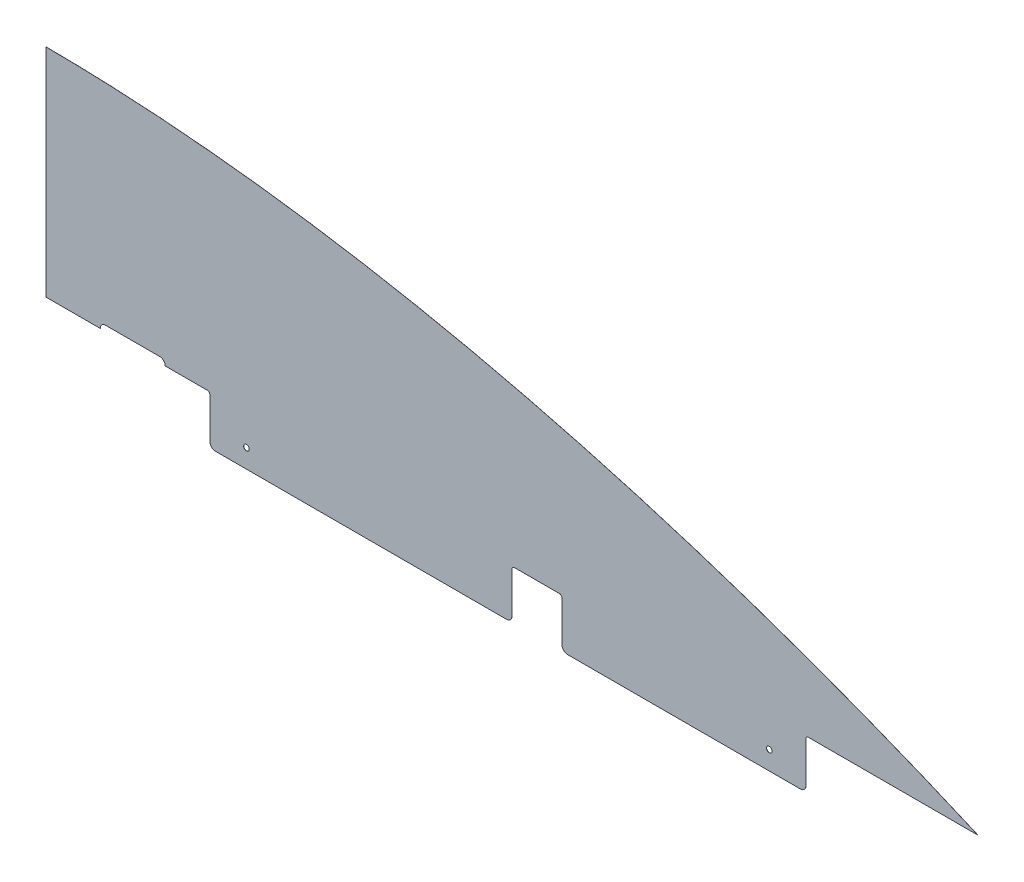
ISO-10303-21;
HEADER;
FILE_DESCRIPTION(('STEP AP214'),'2;1');
FILE_NAME('part.step','',(''),(''),'','','');
FILE_SCHEMA(('AUTOMOTIVE_DESIGN { 1 0 10303 214 1 1 1 1 }'));
ENDSEC;
DATA;
#1=APPLICATION_CONTEXT('core data for automotive mechanical design processes');
#2=APPLICATION_PROTOCOL_DEFINITION('international standard','automotive_design',2000,#1);
#3=PRODUCT_CONTEXT('',#1,'mechanical');
#4=PRODUCT('Part','Part','',(#3));
#5=PRODUCT_RELATED_PRODUCT_CATEGORY('part','',(#4));
#6=PRODUCT_DEFINITION_FORMATION('','',#4);
#7=PRODUCT_DEFINITION_CONTEXT('part definition',#1,'design');
#8=PRODUCT_DEFINITION('design','',#6,#7);
#9=PRODUCT_DEFINITION_SHAPE('','',#8);
#10=(LENGTH_UNIT() NAMED_UNIT(*) SI_UNIT(.MILLI.,.METRE.));
#11=(NAMED_UNIT(*) PLANE_ANGLE_UNIT() SI_UNIT($,.RADIAN.));
#12=(NAMED_UNIT(*) SI_UNIT($,.STERADIAN.) SOLID_ANGLE_UNIT());
#13=UNCERTAINTY_MEASURE_WITH_UNIT(LENGTH_MEASURE(1.E-05),#10,'distance_accuracy_value','');
#14=(GEOMETRIC_REPRESENTATION_CONTEXT(3) GLOBAL_UNCERTAINTY_ASSIGNED_CONTEXT((#13)) GLOBAL_UNIT_ASSIGNED_CONTEXT((#10,
#11,#12)) REPRESENTATION_CONTEXT('',''));
#15=CARTESIAN_POINT('',(0.,0.,0.));
#16=DIRECTION('',(0.,0.,1.));
#17=DIRECTION('',(1.,0.,0.));
#18=AXIS2_PLACEMENT_3D('',#15,#16,#17);
#19=CARTESIAN_POINT('',(566.574596477157,179.041017308607,0.));
#20=DIRECTION('',(0.,0.,1.));
#21=DIRECTION('',(1.,0.,0.));
#22=AXIS2_PLACEMENT_3D('',#19,#20,#21);
#23=PLANE('',#22);
#24=CARTESIAN_POINT('',(234.95,-35.3060000000001,0.));
#25=DIRECTION('',(0.,0.,-1.));
#26=DIRECTION('',(-1.,0.,0.));
#27=AXIS2_PLACEMENT_3D('',#24,#25,#26);
#28=CIRCLE('',#27,3.26389999999993);
#29=CARTESIAN_POINT('',(231.6861,-35.3060000000001,0.));
#30=VERTEX_POINT('',#29);
#31=EDGE_CURVE('E457',#30,#30,#28,.T.);
#32=ORIENTED_EDGE('',*,*,#31,.F.);
#33=EDGE_LOOP('',(#32));
#34=FACE_BOUND('',#33,.T.);
#35=DIRECTION('',(0.,-1.,0.));
#36=VECTOR('',#35,1.);
#37=CARTESIAN_POINT('',(546.1,-57.15,0.));
#38=LINE('',#37,#36);
#39=CARTESIAN_POINT('',(546.1,-3.17499999999999,0.));
#40=VERTEX_POINT('',#39);
#41=CARTESIAN_POINT('',(546.1,-50.8,0.));
#42=VERTEX_POINT('',#41);
#43=EDGE_CURVE('E423',#40,#42,#38,.T.);
#44=ORIENTED_EDGE('',*,*,#43,.T.);
#45=CARTESIAN_POINT('',(539.75,-50.8,0.));
#46=DIRECTION('',(0.,0.,1.));
#47=DIRECTION('',(1.,0.,0.));
#48=AXIS2_PLACEMENT_3D('',#45,#46,#47);
#49=CIRCLE('',#48,6.35);
#50=CARTESIAN_POINT('',(539.75,-57.15,0.));
#51=VERTEX_POINT('',#50);
#52=EDGE_CURVE('E405',#42,#51,#49,.F.);
#53=ORIENTED_EDGE('',*,*,#52,.T.);
#54=DIRECTION('',(-1.,0.,0.));
#55=VECTOR('',#54,1.);
#56=CARTESIAN_POINT('',(192.0875,-57.15,0.));
#57=LINE('',#56,#55);
#58=CARTESIAN_POINT('',(198.4375,-57.15,0.));
#59=VERTEX_POINT('',#58);
#60=EDGE_CURVE('E436',#51,#59,#57,.T.);
#61=ORIENTED_EDGE('',*,*,#60,.T.);
#62=CARTESIAN_POINT('',(198.4375,-50.8,0.));
#63=DIRECTION('',(0.,0.,1.));
#64=DIRECTION('',(1.,0.,0.));
#65=AXIS2_PLACEMENT_3D('',#62,#63,#64);
#66=CIRCLE('',#65,6.35);
#67=CARTESIAN_POINT('',(192.0875,-50.8,0.));
#68=VERTEX_POINT('',#67);
#69=EDGE_CURVE('E53',#59,#68,#66,.F.);
#70=ORIENTED_EDGE('',*,*,#69,.T.);
#71=DIRECTION('',(0.,1.,0.));
#72=VECTOR('',#71,1.);
#73=CARTESIAN_POINT('',(192.0875,0.,0.));
#74=LINE('',#73,#72);
#75=CARTESIAN_POINT('',(192.0875,-3.175,0.));
#76=VERTEX_POINT('',#75);
#77=EDGE_CURVE('E420',#68,#76,#74,.T.);
#78=ORIENTED_EDGE('',*,*,#77,.T.);
#79=CARTESIAN_POINT('',(188.9125,-3.175,0.));
#80=DIRECTION('',(0.,0.,1.));
#81=DIRECTION('',(1.,0.,0.));
#82=AXIS2_PLACEMENT_3D('',#79,#80,#81);
#83=CIRCLE('',#82,3.175);
#84=CARTESIAN_POINT('',(188.9125,0.,0.));
#85=VERTEX_POINT('',#84);
#86=EDGE_CURVE('E194',#76,#85,#83,.T.);
#87=ORIENTED_EDGE('',*,*,#86,.T.);
#88=DIRECTION('',(1.,0.,0.));
#89=VECTOR('',#88,1.);
#90=CARTESIAN_POINT('',(0.,0.,0.));
#91=LINE('',#90,#89);
#92=CARTESIAN_POINT('',(139.7,0.,0.));
#93=VERTEX_POINT('',#92);
#94=EDGE_CURVE('E186',#93,#85,#91,.T.);
#95=ORIENTED_EDGE('',*,*,#94,.F.);
#96=CARTESIAN_POINT('',(133.35,0.,0.));
#97=DIRECTION('',(0.,0.,-1.));
#98=DIRECTION('',(-1.,0.,0.));
#99=AXIS2_PLACEMENT_3D('',#96,#97,#98);
#100=CIRCLE('',#99,6.35000000000017);
#101=CARTESIAN_POINT('',(133.35,6.35000000000018,0.));
#102=VERTEX_POINT('',#101);
#103=EDGE_CURVE('E191',#102,#93,#100,.T.);
#104=ORIENTED_EDGE('',*,*,#103,.F.);
#105=DIRECTION('',(1.,0.,0.));
#106=VECTOR('',#105,1.);
#107=CARTESIAN_POINT('',(69.85,6.35000000000017,0.));
#108=LINE('',#107,#106);
#109=CARTESIAN_POINT('',(69.85,6.35000000000016,0.));
#110=VERTEX_POINT('',#109);
#111=EDGE_CURVE('E220',#110,#102,#108,.T.);
#112=ORIENTED_EDGE('',*,*,#111,.F.);
#113=CARTESIAN_POINT('',(69.85,0.,0.));
#114=DIRECTION('',(0.,0.,-1.));
#115=DIRECTION('',(1.,0.,0.));
#116=AXIS2_PLACEMENT_3D('',#113,#114,#115);
#117=CIRCLE('',#116,6.35000000000008);
#118=CARTESIAN_POINT('',(63.4999999999999,0.,0.));
#119=VERTEX_POINT('',#118);
#120=EDGE_CURVE('E222',#119,#110,#117,.T.);
#121=ORIENTED_EDGE('',*,*,#120,.F.);
#122=CARTESIAN_POINT('',(0.,0.,0.));
#123=VERTEX_POINT('',#122);
#124=EDGE_CURVE('E198',#123,#119,#91,.T.);
#125=ORIENTED_EDGE('',*,*,#124,.F.);
#126=DIRECTION('',(0.,-1.,0.));
#127=VECTOR('',#126,1.);
#128=CARTESIAN_POINT('',(0.,254.,0.));
#129=LINE('',#128,#127);
#130=CARTESIAN_POINT('',(0.,254.,0.));
#131=VERTEX_POINT('',#130);
#132=EDGE_CURVE('E337',#131,#123,#129,.T.);
#133=ORIENTED_EDGE('',*,*,#132,.F.);
#134=CARTESIAN_POINT('',(1092.2,-3.05594159067454E-13,0.));
#135=CARTESIAN_POINT('',(770.285770074945,140.499670678071,0.));
#136=CARTESIAN_POINT('',(376.513153864139,252.276375478215,0.));
#137=CARTESIAN_POINT('',(0.,254.,0.));
#138=B_SPLINE_CURVE_WITH_KNOTS('',3,(#134,#135,#136,#137),.UNSPECIFIED.,.F.,.F.,(4,4),(0.,1.),.UNSPECIFIED.);
#139=CARTESIAN_POINT('',(1092.2,0.,0.));
#140=VERTEX_POINT('',#139);
#141=EDGE_CURVE('E235',#140,#131,#138,.T.);
#142=ORIENTED_EDGE('',*,*,#141,.F.);
#143=CARTESIAN_POINT('',(893.7625,0.,0.));
#144=VERTEX_POINT('',#143);
#145=EDGE_CURVE('E199',#144,#140,#91,.T.);
#146=ORIENTED_EDGE('',*,*,#145,.F.);
#147=CARTESIAN_POINT('',(893.7625,-3.175,0.));
#148=DIRECTION('',(0.,0.,1.));
#149=DIRECTION('',(1.,0.,0.));
#150=AXIS2_PLACEMENT_3D('',#147,#148,#149);
#151=CIRCLE('',#150,3.175);
#152=CARTESIAN_POINT('',(890.5875,-3.175,0.));
#153=VERTEX_POINT('',#152);
#154=EDGE_CURVE('E381',#144,#153,#151,.T.);
#155=ORIENTED_EDGE('',*,*,#154,.T.);
#156=DIRECTION('',(0.,-1.,0.));
#157=VECTOR('',#156,1.);
#158=CARTESIAN_POINT('',(890.5875,0.,0.));
#159=LINE('',#158,#157);
#160=CARTESIAN_POINT('',(890.5875,-50.8,0.));
#161=VERTEX_POINT('',#160);
#162=EDGE_CURVE('E434',#153,#161,#159,.T.);
#163=ORIENTED_EDGE('',*,*,#162,.T.);
#164=CARTESIAN_POINT('',(884.2375,-50.8,0.));
#165=DIRECTION('',(0.,0.,1.));
#166=DIRECTION('',(1.,0.,0.));
#167=AXIS2_PLACEMENT_3D('',#164,#165,#166);
#168=CIRCLE('',#167,6.35);
#169=CARTESIAN_POINT('',(884.2375,-57.15,0.));
#170=VERTEX_POINT('',#169);
#171=EDGE_CURVE('E400',#161,#170,#168,.F.);
#172=ORIENTED_EDGE('',*,*,#171,.T.);
#173=CARTESIAN_POINT('',(611.1875,-57.15,0.));
#174=VERTEX_POINT('',#173);
#175=EDGE_CURVE('E216',#170,#174,#57,.T.);
#176=ORIENTED_EDGE('',*,*,#175,.T.);
#177=CARTESIAN_POINT('',(611.1875,-50.8,0.));
#178=DIRECTION('',(0.,0.,1.));
#179=DIRECTION('',(1.,0.,0.));
#180=AXIS2_PLACEMENT_3D('',#177,#178,#179);
#181=CIRCLE('',#180,6.35);
#182=CARTESIAN_POINT('',(604.8375,-50.8,0.));
#183=VERTEX_POINT('',#182);
#184=EDGE_CURVE('E403',#174,#183,#181,.F.);
#185=ORIENTED_EDGE('',*,*,#184,.T.);
#186=DIRECTION('',(0.,1.,0.));
#187=VECTOR('',#186,1.);
#188=CARTESIAN_POINT('',(604.8375,-57.15,0.));
#189=LINE('',#188,#187);
#190=CARTESIAN_POINT('',(604.8375,-3.175,0.));
#191=VERTEX_POINT('',#190);
#192=EDGE_CURVE('E445',#183,#191,#189,.T.);
#193=ORIENTED_EDGE('',*,*,#192,.T.);
#194=CARTESIAN_POINT('',(601.6625,-3.175,0.));
#195=DIRECTION('',(0.,0.,1.));
#196=DIRECTION('',(1.,0.,0.));
#197=AXIS2_PLACEMENT_3D('',#194,#195,#196);
#198=CIRCLE('',#197,3.175);
#199=CARTESIAN_POINT('',(601.6625,0.,0.));
#200=VERTEX_POINT('',#199);
#201=EDGE_CURVE('E377',#191,#200,#198,.T.);
#202=ORIENTED_EDGE('',*,*,#201,.T.);
#203=DIRECTION('',(-1.,0.,0.));
#204=VECTOR('',#203,1.);
#205=CARTESIAN_POINT('',(604.8375,0.,0.));
#206=LINE('',#205,#204);
#207=CARTESIAN_POINT('',(549.275,0.,0.));
#208=VERTEX_POINT('',#207);
#209=EDGE_CURVE('E428',#200,#208,#206,.T.);
#210=ORIENTED_EDGE('',*,*,#209,.T.);
#211=CARTESIAN_POINT('',(549.275,-3.17499999999999,0.));
#212=DIRECTION('',(0.,0.,1.));
#213=DIRECTION('',(1.,0.,0.));
#214=AXIS2_PLACEMENT_3D('',#211,#212,#213);
#215=CIRCLE('',#214,3.175);
#216=EDGE_CURVE('E372',#208,#40,#215,.T.);
#217=ORIENTED_EDGE('',*,*,#216,.T.);
#218=EDGE_LOOP('',(#44,#53,#61,#70,#78,#87,#95,#104,#112,#121,#125,#133,#142,#146,#155,#163,
#172,#176,#185,#193,#202,#210,#217));
#219=FACE_BOUND('',#218,.T.);
#220=CARTESIAN_POINT('',(847.725,-35.3060000000001,0.));
#221=DIRECTION('',(0.,0.,-1.));
#222=DIRECTION('',(-1.,0.,0.));
#223=AXIS2_PLACEMENT_3D('',#220,#221,#222);
#224=CIRCLE('',#223,3.26389999999999);
#225=CARTESIAN_POINT('',(844.4611,-35.3060000000001,0.));
#226=VERTEX_POINT('',#225);
#227=EDGE_CURVE('E463',#226,#226,#224,.T.);
#228=ORIENTED_EDGE('',*,*,#227,.F.);
#229=EDGE_LOOP('',(#228));
#230=FACE_BOUND('',#229,.T.);
#231=ADVANCED_FACE('F32',(#34,#219,#230),#23,.F.);
#232=CARTESIAN_POINT('',(192.0875,-57.15,-700.834054894595));
#233=DIRECTION('',(0.,-1.,0.));
#234=DIRECTION('',(0.,0.,-1.));
#235=AXIS2_PLACEMENT_3D('',#232,#233,#234);
#236=PLANE('',#235);
#237=DIRECTION('',(1.,0.,0.));
#238=VECTOR('',#237,1.);
#239=CARTESIAN_POINT('',(192.0875,-57.15,0.127));
#240=LINE('',#239,#238);
#241=CARTESIAN_POINT('',(611.1875,-57.15,0.127));
#242=VERTEX_POINT('',#241);
#243=CARTESIAN_POINT('',(884.2375,-57.15,0.127));
#244=VERTEX_POINT('',#243);
#245=EDGE_CURVE('E422',#242,#244,#240,.T.);
#246=ORIENTED_EDGE('',*,*,#245,.F.);
#247=DIRECTION('',(0.,0.,1.));
#248=VECTOR('',#247,1.);
#249=CARTESIAN_POINT('',(611.1875,-57.15,0.));
#250=LINE('',#249,#248);
#251=EDGE_CURVE('E413',#242,#174,#250,.F.);
#252=ORIENTED_EDGE('',*,*,#251,.T.);
#253=ORIENTED_EDGE('',*,*,#175,.F.);
#254=DIRECTION('',(0.,0.,1.));
#255=VECTOR('',#254,1.);
#256=CARTESIAN_POINT('',(884.2375,-57.15,-700.834054894595));
#257=LINE('',#256,#255);
#258=EDGE_CURVE('E410',#170,#244,#257,.T.);
#259=ORIENTED_EDGE('',*,*,#258,.T.);
#260=EDGE_LOOP('',(#246,#252,#253,#259));
#261=FACE_BOUND('',#260,.T.);
#262=ADVANCED_FACE('F289',(#261),#236,.T.);
#263=CARTESIAN_POINT('',(0.,0.,0.127));
#264=DIRECTION('',(0.,1.,0.));
#265=DIRECTION('',(0.,0.,1.));
#266=AXIS2_PLACEMENT_3D('',#263,#264,#265);
#267=PLANE('',#266);
#268=ORIENTED_EDGE('',*,*,#94,.T.);
#269=DIRECTION('',(0.,0.,1.));
#270=VECTOR('',#269,1.);
#271=CARTESIAN_POINT('',(188.9125,0.,0.127));
#272=LINE('',#271,#270);
#273=CARTESIAN_POINT('',(188.9125,0.,0.127));
#274=VERTEX_POINT('',#273);
#275=EDGE_CURVE('E365',#85,#274,#272,.T.);
#276=ORIENTED_EDGE('',*,*,#275,.T.);
#277=DIRECTION('',(1.,0.,0.));
#278=VECTOR('',#277,1.);
#279=CARTESIAN_POINT('',(0.,0.,0.127));
#280=LINE('',#279,#278);
#281=CARTESIAN_POINT('',(139.7,0.,0.127));
#282=VERTEX_POINT('',#281);
#283=EDGE_CURVE('E206',#282,#274,#280,.T.);
#284=ORIENTED_EDGE('',*,*,#283,.F.);
#285=DIRECTION('',(0.,0.,1.));
#286=VECTOR('',#285,1.);
#287=CARTESIAN_POINT('',(139.7,0.,0.));
#288=LINE('',#287,#286);
#289=EDGE_CURVE('E203',#93,#282,#288,.T.);
#290=ORIENTED_EDGE('',*,*,#289,.F.);
#291=EDGE_LOOP('',(#268,#276,#284,#290));
#292=FACE_BOUND('',#291,.T.);
#293=ADVANCED_FACE('F204',(#292),#267,.F.);
#294=DIRECTION('',(0.,0.,1.));
#295=VECTOR('',#294,1.);
#296=CARTESIAN_POINT('',(63.5,0.,0.));
#297=LINE('',#296,#295);
#298=CARTESIAN_POINT('',(63.4999999999999,0.,0.127));
#299=VERTEX_POINT('',#298);
#300=EDGE_CURVE('E225',#119,#299,#297,.T.);
#301=ORIENTED_EDGE('',*,*,#300,.T.);
#302=CARTESIAN_POINT('',(0.,0.,0.127));
#303=VERTEX_POINT('',#302);
#304=EDGE_CURVE('E315',#303,#299,#280,.T.);
#305=ORIENTED_EDGE('',*,*,#304,.F.);
#306=DIRECTION('',(0.,0.,-1.));
#307=VECTOR('',#306,1.);
#308=CARTESIAN_POINT('',(0.,0.,0.127));
#309=LINE('',#308,#307);
#310=EDGE_CURVE('E344',#303,#123,#309,.T.);
#311=ORIENTED_EDGE('',*,*,#310,.T.);
#312=ORIENTED_EDGE('',*,*,#124,.T.);
#313=EDGE_LOOP('',(#301,#305,#311,#312));
#314=FACE_BOUND('',#313,.T.);
#315=ADVANCED_FACE('F301',(#314),#267,.F.);
#316=CARTESIAN_POINT('',(893.7625,0.,0.127));
#317=VERTEX_POINT('',#316);
#318=CARTESIAN_POINT('',(1092.2,0.,0.127));
#319=VERTEX_POINT('',#318);
#320=EDGE_CURVE('E324',#317,#319,#280,.T.);
#321=ORIENTED_EDGE('',*,*,#320,.F.);
#322=DIRECTION('',(0.,0.,1.));
#323=VECTOR('',#322,1.);
#324=CARTESIAN_POINT('',(893.7625,0.,0.127));
#325=LINE('',#324,#323);
#326=EDGE_CURVE('E363',#317,#144,#325,.F.);
#327=ORIENTED_EDGE('',*,*,#326,.T.);
#328=ORIENTED_EDGE('',*,*,#145,.T.);
#329=DIRECTION('',(0.,0.,-1.));
#330=VECTOR('',#329,1.);
#331=CARTESIAN_POINT('',(1092.2,0.,0.127));
#332=LINE('',#331,#330);
#333=EDGE_CURVE('E323',#319,#140,#332,.T.);
#334=ORIENTED_EDGE('',*,*,#333,.F.);
#335=EDGE_LOOP('',(#321,#327,#328,#334));
#336=FACE_BOUND('',#335,.T.);
#337=ADVANCED_FACE('F303',(#336),#267,.F.);
#338=CARTESIAN_POINT('',(566.574596477157,179.041017308607,0.127));
#339=DIRECTION('',(0.,0.,1.));
#340=DIRECTION('',(1.,0.,0.));
#341=AXIS2_PLACEMENT_3D('',#338,#339,#340);
#342=PLANE('',#341);
#343=CARTESIAN_POINT('',(847.725,-35.3060000000001,0.127));
#344=DIRECTION('',(0.,0.,-1.));
#345=DIRECTION('',(-1.,0.,0.));
#346=AXIS2_PLACEMENT_3D('',#343,#344,#345);
#347=CIRCLE('',#346,3.26389999999999);
#348=CARTESIAN_POINT('',(844.4611,-35.3060000000001,0.127));
#349=VERTEX_POINT('',#348);
#350=EDGE_CURVE('E460',#349,#349,#347,.T.);
#351=ORIENTED_EDGE('',*,*,#350,.T.);
#352=EDGE_LOOP('',(#351));
#353=FACE_BOUND('',#352,.T.);
#354=CARTESIAN_POINT('',(234.95,-35.3060000000001,0.127));
#355=DIRECTION('',(0.,0.,-1.));
#356=DIRECTION('',(-1.,0.,0.));
#357=AXIS2_PLACEMENT_3D('',#354,#355,#356);
#358=CIRCLE('',#357,3.26389999999999);
#359=CARTESIAN_POINT('',(231.6861,-35.3060000000001,0.127));
#360=VERTEX_POINT('',#359);
#361=EDGE_CURVE('E450',#360,#360,#358,.T.);
#362=ORIENTED_EDGE('',*,*,#361,.T.);
#363=EDGE_LOOP('',(#362));
#364=FACE_BOUND('',#363,.T.);
#365=CARTESIAN_POINT('',(198.4375,-57.15,0.127));
#366=VERTEX_POINT('',#365);
#367=CARTESIAN_POINT('',(539.75,-57.15,0.127));
#368=VERTEX_POINT('',#367);
#369=EDGE_CURVE('E426',#366,#368,#240,.T.);
#370=ORIENTED_EDGE('',*,*,#369,.T.);
#371=CARTESIAN_POINT('',(539.75,-50.8,0.126999999999988));
#372=DIRECTION('',(0.,0.,1.));
#373=DIRECTION('',(1.,0.,0.));
#374=AXIS2_PLACEMENT_3D('',#371,#372,#373);
#375=CIRCLE('',#374,6.35);
#376=CARTESIAN_POINT('',(546.1,-50.8,0.127));
#377=VERTEX_POINT('',#376);
#378=EDGE_CURVE('E396',#368,#377,#375,.T.);
#379=ORIENTED_EDGE('',*,*,#378,.T.);
#380=DIRECTION('',(0.,-1.,0.));
#381=VECTOR('',#380,1.);
#382=CARTESIAN_POINT('',(546.1,-57.15,0.127));
#383=LINE('',#382,#381);
#384=CARTESIAN_POINT('',(546.1,-3.17499999999999,0.127));
#385=VERTEX_POINT('',#384);
#386=EDGE_CURVE('E442',#385,#377,#383,.T.);
#387=ORIENTED_EDGE('',*,*,#386,.F.);
#388=CARTESIAN_POINT('',(549.275,-3.17499999999999,0.127));
#389=DIRECTION('',(0.,0.,1.));
#390=DIRECTION('',(1.,0.,0.));
#391=AXIS2_PLACEMENT_3D('',#388,#389,#390);
#392=CIRCLE('',#391,3.175);
#393=CARTESIAN_POINT('',(549.275,0.,0.127));
#394=VERTEX_POINT('',#393);
#395=EDGE_CURVE('E370',#385,#394,#392,.F.);
#396=ORIENTED_EDGE('',*,*,#395,.T.);
#397=DIRECTION('',(-1.,0.,0.));
#398=VECTOR('',#397,1.);
#399=CARTESIAN_POINT('',(604.8375,0.,0.127));
#400=LINE('',#399,#398);
#401=CARTESIAN_POINT('',(601.6625,0.,0.127));
#402=VERTEX_POINT('',#401);
#403=EDGE_CURVE('E446',#402,#394,#400,.T.);
#404=ORIENTED_EDGE('',*,*,#403,.F.);
#405=CARTESIAN_POINT('',(601.6625,-3.175,0.127));
#406=DIRECTION('',(0.,0.,1.));
#407=DIRECTION('',(1.,0.,0.));
#408=AXIS2_PLACEMENT_3D('',#405,#406,#407);
#409=CIRCLE('',#408,3.175);
#410=CARTESIAN_POINT('',(604.8375,-3.175,0.127));
#411=VERTEX_POINT('',#410);
#412=EDGE_CURVE('E374',#402,#411,#409,.F.);
#413=ORIENTED_EDGE('',*,*,#412,.T.);
#414=DIRECTION('',(0.,1.,0.));
#415=VECTOR('',#414,1.);
#416=CARTESIAN_POINT('',(604.8375,-57.15,0.127));
#417=LINE('',#416,#415);
#418=CARTESIAN_POINT('',(604.8375,-50.8,0.127));
#419=VERTEX_POINT('',#418);
#420=EDGE_CURVE('E449',#419,#411,#417,.T.);
#421=ORIENTED_EDGE('',*,*,#420,.F.);
#422=CARTESIAN_POINT('',(611.1875,-50.8,0.127));
#423=DIRECTION('',(0.,0.,1.));
#424=DIRECTION('',(1.,0.,0.));
#425=AXIS2_PLACEMENT_3D('',#422,#423,#424);
#426=CIRCLE('',#425,6.35);
#427=EDGE_CURVE('E394',#419,#242,#426,.T.);
#428=ORIENTED_EDGE('',*,*,#427,.T.);
#429=ORIENTED_EDGE('',*,*,#245,.T.);
#430=CARTESIAN_POINT('',(884.2375,-50.8,0.126999999999988));
#431=DIRECTION('',(0.,0.,1.));
#432=DIRECTION('',(1.,0.,0.));
#433=AXIS2_PLACEMENT_3D('',#430,#431,#432);
#434=CIRCLE('',#433,6.35);
#435=CARTESIAN_POINT('',(890.5875,-50.8,0.127));
#436=VERTEX_POINT('',#435);
#437=EDGE_CURVE('E390',#244,#436,#434,.T.);
#438=ORIENTED_EDGE('',*,*,#437,.T.);
#439=DIRECTION('',(0.,1.,0.));
#440=VECTOR('',#439,1.);
#441=CARTESIAN_POINT('',(890.5875,0.,0.127));
#442=LINE('',#441,#440);
#443=CARTESIAN_POINT('',(890.5875,-3.175,0.127));
#444=VERTEX_POINT('',#443);
#445=EDGE_CURVE('E433',#436,#444,#442,.T.);
#446=ORIENTED_EDGE('',*,*,#445,.T.);
#447=CARTESIAN_POINT('',(893.7625,-3.175,0.126999999999988));
#448=DIRECTION('',(0.,0.,1.));
#449=DIRECTION('',(1.,0.,0.));
#450=AXIS2_PLACEMENT_3D('',#447,#448,#449);
#451=CIRCLE('',#450,3.175);
#452=EDGE_CURVE('E379',#444,#317,#451,.F.);
#453=ORIENTED_EDGE('',*,*,#452,.T.);
#454=ORIENTED_EDGE('',*,*,#320,.T.);
#455=CARTESIAN_POINT('',(1092.2,-3.05594159067454E-13,0.127));
#456=CARTESIAN_POINT('',(770.285770074945,140.499670678071,0.127));
#457=CARTESIAN_POINT('',(376.513153864139,252.276375478215,0.127));
#458=CARTESIAN_POINT('',(0.,254.,0.127));
#459=B_SPLINE_CURVE_WITH_KNOTS('',3,(#455,#456,#457,#458),.UNSPECIFIED.,.F.,.F.,(4,4),(0.,1.),.UNSPECIFIED.);
#460=CARTESIAN_POINT('',(0.,254.,0.127));
#461=VERTEX_POINT('',#460);
#462=EDGE_CURVE('E236',#319,#461,#459,.T.);
#463=ORIENTED_EDGE('',*,*,#462,.T.);
#464=DIRECTION('',(0.,-1.,0.));
#465=VECTOR('',#464,1.);
#466=CARTESIAN_POINT('',(0.,254.,0.127));
#467=LINE('',#466,#465);
#468=EDGE_CURVE('E242',#461,#303,#467,.T.);
#469=ORIENTED_EDGE('',*,*,#468,.T.);
#470=ORIENTED_EDGE('',*,*,#304,.T.);
#471=CARTESIAN_POINT('',(69.85,0.,0.127));
#472=DIRECTION('',(0.,0.,1.));
#473=DIRECTION('',(1.,0.,0.));
#474=AXIS2_PLACEMENT_3D('',#471,#472,#473);
#475=CIRCLE('',#474,6.35000000000008);
#476=CARTESIAN_POINT('',(69.85,6.35000000000016,0.127));
#477=VERTEX_POINT('',#476);
#478=EDGE_CURVE('E233',#299,#477,#475,.F.);
#479=ORIENTED_EDGE('',*,*,#478,.T.);
#480=DIRECTION('',(1.,0.,0.));
#481=VECTOR('',#480,1.);
#482=CARTESIAN_POINT('',(566.574596477157,6.35000000000027,0.127));
#483=LINE('',#482,#481);
#484=CARTESIAN_POINT('',(133.35,6.35000000000018,0.127));
#485=VERTEX_POINT('',#484);
#486=EDGE_CURVE('E231',#477,#485,#483,.T.);
#487=ORIENTED_EDGE('',*,*,#486,.T.);
#488=CARTESIAN_POINT('',(133.35,0.,0.127));
#489=DIRECTION('',(0.,0.,1.));
#490=DIRECTION('',(1.,0.,0.));
#491=AXIS2_PLACEMENT_3D('',#488,#489,#490);
#492=CIRCLE('',#491,6.35000000000017);
#493=EDGE_CURVE('E224',#485,#282,#492,.F.);
#494=ORIENTED_EDGE('',*,*,#493,.T.);
#495=ORIENTED_EDGE('',*,*,#283,.T.);
#496=CARTESIAN_POINT('',(188.9125,-3.175,0.127));
#497=DIRECTION('',(0.,0.,1.));
#498=DIRECTION('',(1.,0.,0.));
#499=AXIS2_PLACEMENT_3D('',#496,#497,#498);
#500=CIRCLE('',#499,3.175);
#501=CARTESIAN_POINT('',(192.0875,-3.175,0.127));
#502=VERTEX_POINT('',#501);
#503=EDGE_CURVE('E330',#274,#502,#500,.F.);
#504=ORIENTED_EDGE('',*,*,#503,.T.);
#505=DIRECTION('',(0.,-1.,0.));
#506=VECTOR('',#505,1.);
#507=CARTESIAN_POINT('',(192.0875,0.,0.127));
#508=LINE('',#507,#506);
#509=CARTESIAN_POINT('',(192.0875,-50.8,0.127));
#510=VERTEX_POINT('',#509);
#511=EDGE_CURVE('E418',#502,#510,#508,.T.);
#512=ORIENTED_EDGE('',*,*,#511,.T.);
#513=CARTESIAN_POINT('',(198.4375,-50.8,0.126999999999988));
#514=DIRECTION('',(0.,0.,1.));
#515=DIRECTION('',(1.,0.,0.));
#516=AXIS2_PLACEMENT_3D('',#513,#514,#515);
#517=CIRCLE('',#516,6.35);
#518=EDGE_CURVE('E392',#510,#366,#517,.T.);
#519=ORIENTED_EDGE('',*,*,#518,.T.);
#520=EDGE_LOOP('',(#370,#379,#387,#396,#404,#413,#421,#428,#429,#438,#446,#453,#454,#463,#469,
#470,#479,#487,#494,#495,#504,#512,#519));
#521=FACE_BOUND('',#520,.T.);
#522=ADVANCED_FACE('F253',(#353,#364,#521),#342,.T.);
#523=DIRECTION('',(0.,0.,-1.));
#524=VECTOR('',#523,1.);
#525=SURFACE_OF_LINEAR_EXTRUSION('',#459,#524);
#526=ORIENTED_EDGE('',*,*,#141,.T.);
#527=DIRECTION('',(0.,0.,-1.));
#528=VECTOR('',#527,1.);
#529=CARTESIAN_POINT('',(0.,254.,0.127));
#530=LINE('',#529,#528);
#531=EDGE_CURVE('E346',#461,#131,#530,.T.);
#532=ORIENTED_EDGE('',*,*,#531,.F.);
#533=ORIENTED_EDGE('',*,*,#462,.F.);
#534=ORIENTED_EDGE('',*,*,#333,.T.);
#535=EDGE_LOOP('',(#526,#532,#533,#534));
#536=FACE_BOUND('',#535,.T.);
#537=ADVANCED_FACE('F248',(#536),#525,.F.);
#538=CARTESIAN_POINT('',(0.,254.,0.127));
#539=DIRECTION('',(1.,0.,0.));
#540=DIRECTION('',(0.,1.,0.));
#541=AXIS2_PLACEMENT_3D('',#538,#539,#540);
#542=PLANE('',#541);
#543=ORIENTED_EDGE('',*,*,#132,.T.);
#544=ORIENTED_EDGE('',*,*,#310,.F.);
#545=ORIENTED_EDGE('',*,*,#468,.F.);
#546=ORIENTED_EDGE('',*,*,#531,.T.);
#547=EDGE_LOOP('',(#543,#544,#545,#546));
#548=FACE_BOUND('',#547,.T.);
#549=ADVANCED_FACE('F252',(#548),#542,.F.);
#550=CARTESIAN_POINT('',(69.85,0.,0.));
#551=DIRECTION('',(0.,0.,1.));
#552=DIRECTION('',(1.,0.,0.));
#553=AXIS2_PLACEMENT_3D('',#550,#551,#552);
#554=CYLINDRICAL_SURFACE('',#553,6.35000000000008);
#555=ORIENTED_EDGE('',*,*,#478,.F.);
#556=ORIENTED_EDGE('',*,*,#300,.F.);
#557=ORIENTED_EDGE('',*,*,#120,.T.);
#558=DIRECTION('',(0.,0.,1.));
#559=VECTOR('',#558,1.);
#560=CARTESIAN_POINT('',(69.85,6.35000000000008,0.));
#561=LINE('',#560,#559);
#562=EDGE_CURVE('E209',#110,#477,#561,.T.);
#563=ORIENTED_EDGE('',*,*,#562,.T.);
#564=EDGE_LOOP('',(#555,#556,#557,#563));
#565=FACE_BOUND('',#564,.T.);
#566=ADVANCED_FACE('F325',(#565),#554,.F.);
#567=CARTESIAN_POINT('',(69.85,6.35000000000017,0.));
#568=DIRECTION('',(0.,-1.,0.));
#569=DIRECTION('',(1.,0.,0.));
#570=AXIS2_PLACEMENT_3D('',#567,#568,#569);
#571=PLANE('',#570);
#572=ORIENTED_EDGE('',*,*,#486,.F.);
#573=ORIENTED_EDGE('',*,*,#562,.F.);
#574=ORIENTED_EDGE('',*,*,#111,.T.);
#575=DIRECTION('',(0.,0.,1.));
#576=VECTOR('',#575,1.);
#577=CARTESIAN_POINT('',(133.35,6.35000000000019,0.));
#578=LINE('',#577,#576);
#579=EDGE_CURVE('E213',#102,#485,#578,.T.);
#580=ORIENTED_EDGE('',*,*,#579,.T.);
#581=EDGE_LOOP('',(#572,#573,#574,#580));
#582=FACE_BOUND('',#581,.T.);
#583=ADVANCED_FACE('F328',(#582),#571,.T.);
#584=CARTESIAN_POINT('',(133.35,0.,0.));
#585=DIRECTION('',(0.,0.,1.));
#586=DIRECTION('',(1.,0.,0.));
#587=AXIS2_PLACEMENT_3D('',#584,#585,#586);
#588=CYLINDRICAL_SURFACE('',#587,6.35000000000017);
#589=ORIENTED_EDGE('',*,*,#493,.F.);
#590=ORIENTED_EDGE('',*,*,#579,.F.);
#591=ORIENTED_EDGE('',*,*,#103,.T.);
#592=ORIENTED_EDGE('',*,*,#289,.T.);
#593=EDGE_LOOP('',(#589,#590,#591,#592));
#594=FACE_BOUND('',#593,.T.);
#595=ADVANCED_FACE('F211',(#594),#588,.F.);
#596=CARTESIAN_POINT('',(192.0875,0.,-700.834054894595));
#597=DIRECTION('',(-1.,0.,0.));
#598=DIRECTION('',(0.,0.,1.));
#599=AXIS2_PLACEMENT_3D('',#596,#597,#598);
#600=PLANE('',#599);
#601=ORIENTED_EDGE('',*,*,#77,.F.);
#602=DIRECTION('',(0.,0.,1.));
#603=VECTOR('',#602,1.);
#604=CARTESIAN_POINT('',(192.0875,-50.8,-700.834054894595));
#605=LINE('',#604,#603);
#606=EDGE_CURVE('E40',#68,#510,#605,.T.);
#607=ORIENTED_EDGE('',*,*,#606,.T.);
#608=ORIENTED_EDGE('',*,*,#511,.F.);
#609=DIRECTION('',(0.,0.,1.));
#610=VECTOR('',#609,1.);
#611=CARTESIAN_POINT('',(192.0875,-3.175,-700.834054894595));
#612=LINE('',#611,#610);
#613=EDGE_CURVE('E367',#502,#76,#612,.F.);
#614=ORIENTED_EDGE('',*,*,#613,.T.);
#615=EDGE_LOOP('',(#601,#607,#608,#614));
#616=FACE_BOUND('',#615,.T.);
#617=ADVANCED_FACE('F417',(#616),#600,.T.);
#618=CARTESIAN_POINT('',(890.5875,0.,-700.834054894595));
#619=DIRECTION('',(1.,0.,0.));
#620=DIRECTION('',(0.,0.,-1.));
#621=AXIS2_PLACEMENT_3D('',#618,#619,#620);
#622=PLANE('',#621);
#623=ORIENTED_EDGE('',*,*,#445,.F.);
#624=DIRECTION('',(0.,0.,1.));
#625=VECTOR('',#624,1.);
#626=CARTESIAN_POINT('',(890.5875,-50.8,-700.834054894595));
#627=LINE('',#626,#625);
#628=EDGE_CURVE('E11',#436,#161,#627,.F.);
#629=ORIENTED_EDGE('',*,*,#628,.T.);
#630=ORIENTED_EDGE('',*,*,#162,.F.);
#631=DIRECTION('',(0.,0.,1.));
#632=VECTOR('',#631,1.);
#633=CARTESIAN_POINT('',(890.5875,-3.175,-700.834054894595));
#634=LINE('',#633,#632);
#635=EDGE_CURVE('E360',#153,#444,#634,.T.);
#636=ORIENTED_EDGE('',*,*,#635,.T.);
#637=EDGE_LOOP('',(#623,#629,#630,#636));
#638=FACE_BOUND('',#637,.T.);
#639=ADVANCED_FACE('F489',(#638),#622,.T.);
#640=ORIENTED_EDGE('',*,*,#60,.F.);
#641=DIRECTION('',(0.,0.,1.));
#642=VECTOR('',#641,1.);
#643=CARTESIAN_POINT('',(539.75,-57.15,0.126999999999988));
#644=LINE('',#643,#642);
#645=EDGE_CURVE('E387',#51,#368,#644,.T.);
#646=ORIENTED_EDGE('',*,*,#645,.T.);
#647=ORIENTED_EDGE('',*,*,#369,.F.);
#648=DIRECTION('',(0.,0.,1.));
#649=VECTOR('',#648,1.);
#650=CARTESIAN_POINT('',(198.4375,-57.15,-700.834054894595));
#651=LINE('',#650,#649);
#652=EDGE_CURVE('E385',#366,#59,#651,.F.);
#653=ORIENTED_EDGE('',*,*,#652,.T.);
#654=EDGE_LOOP('',(#640,#646,#647,#653));
#655=FACE_BOUND('',#654,.T.);
#656=ADVANCED_FACE('F297',(#655),#236,.T.);
#657=CARTESIAN_POINT('',(604.8375,-57.15,0.));
#658=DIRECTION('',(1.,0.,0.));
#659=DIRECTION('',(0.,0.,-1.));
#660=AXIS2_PLACEMENT_3D('',#657,#658,#659);
#661=PLANE('',#660);
#662=ORIENTED_EDGE('',*,*,#192,.F.);
#663=DIRECTION('',(0.,0.,1.));
#664=VECTOR('',#663,1.);
#665=CARTESIAN_POINT('',(604.8375,-50.8,0.127));
#666=LINE('',#665,#664);
#667=EDGE_CURVE('E407',#183,#419,#666,.T.);
#668=ORIENTED_EDGE('',*,*,#667,.T.);
#669=ORIENTED_EDGE('',*,*,#420,.T.);
#670=DIRECTION('',(0.,0.,1.));
#671=VECTOR('',#670,1.);
#672=CARTESIAN_POINT('',(604.8375,-3.175,0.));
#673=LINE('',#672,#671);
#674=EDGE_CURVE('E357',#411,#191,#673,.F.);
#675=ORIENTED_EDGE('',*,*,#674,.T.);
#676=EDGE_LOOP('',(#662,#668,#669,#675));
#677=FACE_BOUND('',#676,.T.);
#678=ADVANCED_FACE('F481',(#677),#661,.F.);
#679=CARTESIAN_POINT('',(546.1,-57.15,0.));
#680=DIRECTION('',(-1.,0.,0.));
#681=DIRECTION('',(0.,0.,1.));
#682=AXIS2_PLACEMENT_3D('',#679,#680,#681);
#683=PLANE('',#682);
#684=ORIENTED_EDGE('',*,*,#386,.T.);
#685=DIRECTION('',(0.,0.,1.));
#686=VECTOR('',#685,1.);
#687=CARTESIAN_POINT('',(546.1,-50.8,0.));
#688=LINE('',#687,#686);
#689=EDGE_CURVE('E398',#377,#42,#688,.F.);
#690=ORIENTED_EDGE('',*,*,#689,.T.);
#691=ORIENTED_EDGE('',*,*,#43,.F.);
#692=DIRECTION('',(0.,0.,1.));
#693=VECTOR('',#692,1.);
#694=CARTESIAN_POINT('',(546.1,-3.17499999999999,0.127));
#695=LINE('',#694,#693);
#696=EDGE_CURVE('E349',#40,#385,#695,.T.);
#697=ORIENTED_EDGE('',*,*,#696,.T.);
#698=EDGE_LOOP('',(#684,#690,#691,#697));
#699=FACE_BOUND('',#698,.T.);
#700=ADVANCED_FACE('F478',(#699),#683,.F.);
#701=CARTESIAN_POINT('',(604.8375,0.,0.));
#702=DIRECTION('',(0.,1.,0.));
#703=DIRECTION('',(-1.,0.,0.));
#704=AXIS2_PLACEMENT_3D('',#701,#702,#703);
#705=PLANE('',#704);
#706=ORIENTED_EDGE('',*,*,#403,.T.);
#707=DIRECTION('',(0.,0.,1.));
#708=VECTOR('',#707,1.);
#709=CARTESIAN_POINT('',(549.275,0.,0.));
#710=LINE('',#709,#708);
#711=EDGE_CURVE('E355',#394,#208,#710,.F.);
#712=ORIENTED_EDGE('',*,*,#711,.T.);
#713=ORIENTED_EDGE('',*,*,#209,.F.);
#714=DIRECTION('',(0.,0.,1.));
#715=VECTOR('',#714,1.);
#716=CARTESIAN_POINT('',(601.6625,0.,0.127));
#717=LINE('',#716,#715);
#718=EDGE_CURVE('E352',#200,#402,#717,.T.);
#719=ORIENTED_EDGE('',*,*,#718,.T.);
#720=EDGE_LOOP('',(#706,#712,#713,#719));
#721=FACE_BOUND('',#720,.T.);
#722=ADVANCED_FACE('F260',(#721),#705,.F.);
#723=CARTESIAN_POINT('',(549.275,-3.17499999999999,0.));
#724=DIRECTION('',(0.,0.,-1.));
#725=DIRECTION('',(-1.,0.,0.));
#726=AXIS2_PLACEMENT_3D('',#723,#724,#725);
#727=CYLINDRICAL_SURFACE('',#726,3.175);
#728=ORIENTED_EDGE('',*,*,#216,.F.);
#729=ORIENTED_EDGE('',*,*,#711,.F.);
#730=ORIENTED_EDGE('',*,*,#395,.F.);
#731=ORIENTED_EDGE('',*,*,#696,.F.);
#732=EDGE_LOOP('',(#728,#729,#730,#731));
#733=FACE_BOUND('',#732,.T.);
#734=ADVANCED_FACE('F256',(#733),#727,.F.);
#735=CARTESIAN_POINT('',(601.6625,-3.175,0.));
#736=DIRECTION('',(0.,0.,-1.));
#737=DIRECTION('',(-1.,0.,0.));
#738=AXIS2_PLACEMENT_3D('',#735,#736,#737);
#739=CYLINDRICAL_SURFACE('',#738,3.175);
#740=ORIENTED_EDGE('',*,*,#201,.F.);
#741=ORIENTED_EDGE('',*,*,#674,.F.);
#742=ORIENTED_EDGE('',*,*,#412,.F.);
#743=ORIENTED_EDGE('',*,*,#718,.F.);
#744=EDGE_LOOP('',(#740,#741,#742,#743));
#745=FACE_BOUND('',#744,.T.);
#746=ADVANCED_FACE('F259',(#745),#739,.F.);
#747=CARTESIAN_POINT('',(893.7625,-3.175,-700.834054894595));
#748=DIRECTION('',(0.,0.,1.));
#749=DIRECTION('',(1.,0.,0.));
#750=AXIS2_PLACEMENT_3D('',#747,#748,#749);
#751=CYLINDRICAL_SURFACE('',#750,3.175);
#752=ORIENTED_EDGE('',*,*,#154,.F.);
#753=ORIENTED_EDGE('',*,*,#326,.F.);
#754=ORIENTED_EDGE('',*,*,#452,.F.);
#755=ORIENTED_EDGE('',*,*,#635,.F.);
#756=EDGE_LOOP('',(#752,#753,#754,#755));
#757=FACE_BOUND('',#756,.T.);
#758=ADVANCED_FACE('F264',(#757),#751,.F.);
#759=CARTESIAN_POINT('',(188.9125,-3.175,0.127));
#760=DIRECTION('',(0.,0.,1.));
#761=DIRECTION('',(1.,0.,0.));
#762=AXIS2_PLACEMENT_3D('',#759,#760,#761);
#763=CYLINDRICAL_SURFACE('',#762,3.175);
#764=ORIENTED_EDGE('',*,*,#86,.F.);
#765=ORIENTED_EDGE('',*,*,#613,.F.);
#766=ORIENTED_EDGE('',*,*,#503,.F.);
#767=ORIENTED_EDGE('',*,*,#275,.F.);
#768=EDGE_LOOP('',(#764,#765,#766,#767));
#769=FACE_BOUND('',#768,.T.);
#770=ADVANCED_FACE('F268',(#769),#763,.F.);
#771=CARTESIAN_POINT('',(539.75,-50.8,-700.834054894595));
#772=DIRECTION('',(0.,0.,-1.));
#773=DIRECTION('',(-1.,0.,0.));
#774=AXIS2_PLACEMENT_3D('',#771,#772,#773);
#775=CYLINDRICAL_SURFACE('',#774,6.35);
#776=ORIENTED_EDGE('',*,*,#52,.F.);
#777=ORIENTED_EDGE('',*,*,#689,.F.);
#778=ORIENTED_EDGE('',*,*,#378,.F.);
#779=ORIENTED_EDGE('',*,*,#645,.F.);
#780=EDGE_LOOP('',(#776,#777,#778,#779));
#781=FACE_BOUND('',#780,.T.);
#782=ADVANCED_FACE('F272',(#781),#775,.T.);
#783=CARTESIAN_POINT('',(611.1875,-50.8,0.));
#784=DIRECTION('',(0.,0.,-1.));
#785=DIRECTION('',(-1.,0.,0.));
#786=AXIS2_PLACEMENT_3D('',#783,#784,#785);
#787=CYLINDRICAL_SURFACE('',#786,6.35);
#788=ORIENTED_EDGE('',*,*,#184,.F.);
#789=ORIENTED_EDGE('',*,*,#251,.F.);
#790=ORIENTED_EDGE('',*,*,#427,.F.);
#791=ORIENTED_EDGE('',*,*,#667,.F.);
#792=EDGE_LOOP('',(#788,#789,#790,#791));
#793=FACE_BOUND('',#792,.T.);
#794=ADVANCED_FACE('F276',(#793),#787,.T.);
#795=CARTESIAN_POINT('',(198.4375,-50.8,-700.834054894595));
#796=DIRECTION('',(0.,0.,1.));
#797=DIRECTION('',(1.,0.,0.));
#798=AXIS2_PLACEMENT_3D('',#795,#796,#797);
#799=CYLINDRICAL_SURFACE('',#798,6.35);
#800=ORIENTED_EDGE('',*,*,#69,.F.);
#801=ORIENTED_EDGE('',*,*,#652,.F.);
#802=ORIENTED_EDGE('',*,*,#518,.F.);
#803=ORIENTED_EDGE('',*,*,#606,.F.);
#804=EDGE_LOOP('',(#800,#801,#802,#803));
#805=FACE_BOUND('',#804,.T.);
#806=ADVANCED_FACE('F279',(#805),#799,.T.);
#807=CARTESIAN_POINT('',(884.2375,-50.8,-700.834054894595));
#808=DIRECTION('',(0.,0.,1.));
#809=DIRECTION('',(1.,0.,0.));
#810=AXIS2_PLACEMENT_3D('',#807,#808,#809);
#811=CYLINDRICAL_SURFACE('',#810,6.35);
#812=ORIENTED_EDGE('',*,*,#171,.F.);
#813=ORIENTED_EDGE('',*,*,#628,.F.);
#814=ORIENTED_EDGE('',*,*,#437,.F.);
#815=ORIENTED_EDGE('',*,*,#258,.F.);
#816=EDGE_LOOP('',(#812,#813,#814,#815));
#817=FACE_BOUND('',#816,.T.);
#818=ADVANCED_FACE('F34',(#817),#811,.T.);
#819=CARTESIAN_POINT('',(234.95,-35.3060000000001,0.));
#820=DIRECTION('',(0.,0.,-1.));
#821=DIRECTION('',(-1.,0.,0.));
#822=AXIS2_PLACEMENT_3D('',#819,#820,#821);
#823=CYLINDRICAL_SURFACE('',#822,3.26389999999996);
#824=ORIENTED_EDGE('',*,*,#361,.F.);
#825=EDGE_LOOP('',(#824));
#826=FACE_BOUND('',#825,.T.);
#827=ORIENTED_EDGE('',*,*,#31,.T.);
#828=EDGE_LOOP('',(#827));
#829=FACE_BOUND('',#828,.T.);
#830=ADVANCED_FACE('F286',(#826,#829),#823,.F.);
#831=CARTESIAN_POINT('',(847.725,-35.3060000000001,0.));
#832=DIRECTION('',(0.,0.,-1.));
#833=DIRECTION('',(-1.,0.,0.));
#834=AXIS2_PLACEMENT_3D('',#831,#832,#833);
#835=CYLINDRICAL_SURFACE('',#834,3.26389999999999);
#836=ORIENTED_EDGE('',*,*,#350,.F.);
#837=EDGE_LOOP('',(#836));
#838=FACE_BOUND('',#837,.T.);
#839=ORIENTED_EDGE('',*,*,#227,.T.);
#840=EDGE_LOOP('',(#839));
#841=FACE_BOUND('',#840,.T.);
#842=ADVANCED_FACE('F467',(#838,#841),#835,.F.);
#843=CLOSED_SHELL('',(#231,#262,#293,#315,#337,#522,#537,#549,#566,#583,#595,#617,#639,#656,
#678,#700,#722,#734,#746,#758,#770,#782,#794,#806,#818,#830,#842));
#844=MANIFOLD_SOLID_BREP('B2',#843);
#845=ADVANCED_BREP_SHAPE_REPRESENTATION('',(#18,#844),#14);
#846=SHAPE_DEFINITION_REPRESENTATION(#9,#845);
ENDSEC;
END-ISO-10303-21;
